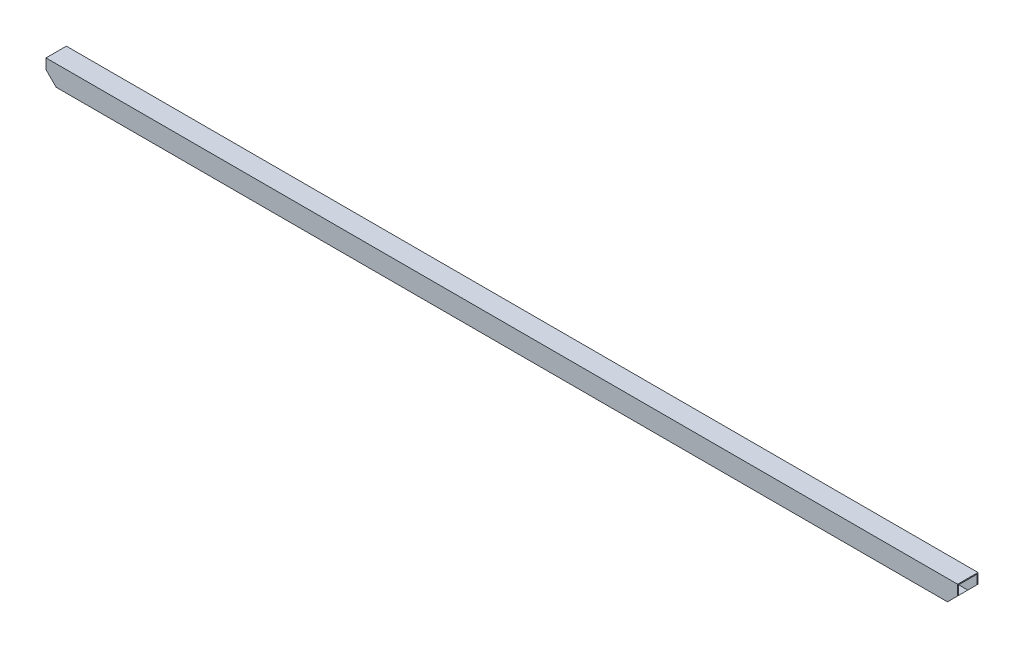
ISO-10303-21;
HEADER;
FILE_DESCRIPTION(('STEP AP214'),'2;1');
FILE_NAME('part.step','',(''),(''),'','','');
FILE_SCHEMA(('AUTOMOTIVE_DESIGN { 1 0 10303 214 1 1 1 1 }'));
ENDSEC;
DATA;
#1=APPLICATION_CONTEXT('core data for automotive mechanical design processes');
#2=APPLICATION_PROTOCOL_DEFINITION('international standard','automotive_design',2000,#1);
#3=PRODUCT_CONTEXT('',#1,'mechanical');
#4=PRODUCT('Part','Part','',(#3));
#5=PRODUCT_RELATED_PRODUCT_CATEGORY('part','',(#4));
#6=PRODUCT_DEFINITION_FORMATION('','',#4);
#7=PRODUCT_DEFINITION_CONTEXT('part definition',#1,'design');
#8=PRODUCT_DEFINITION('design','',#6,#7);
#9=PRODUCT_DEFINITION_SHAPE('','',#8);
#10=(LENGTH_UNIT() NAMED_UNIT(*) SI_UNIT(.MILLI.,.METRE.));
#11=(NAMED_UNIT(*) PLANE_ANGLE_UNIT() SI_UNIT($,.RADIAN.));
#12=(NAMED_UNIT(*) SI_UNIT($,.STERADIAN.) SOLID_ANGLE_UNIT());
#13=UNCERTAINTY_MEASURE_WITH_UNIT(LENGTH_MEASURE(1.E-05),#10,'distance_accuracy_value','');
#14=(GEOMETRIC_REPRESENTATION_CONTEXT(3) GLOBAL_UNCERTAINTY_ASSIGNED_CONTEXT((#13)) GLOBAL_UNIT_ASSIGNED_CONTEXT((#10,
#11,#12)) REPRESENTATION_CONTEXT('',''));
#15=CARTESIAN_POINT('',(0.,0.,0.));
#16=DIRECTION('',(0.,0.,1.));
#17=DIRECTION('',(1.,0.,0.));
#18=AXIS2_PLACEMENT_3D('',#15,#16,#17);
#19=CARTESIAN_POINT('',(-568.325,25.4,12.7));
#20=DIRECTION('',(0.,0.,-1.));
#21=DIRECTION('',(-1.,0.,0.));
#22=AXIS2_PLACEMENT_3D('',#19,#20,#21);
#23=PLANE('',#22);
#24=DIRECTION('',(-0.706542447553431,0.707670664790626,0.));
#25=VECTOR('',#24,1.);
#26=CARTESIAN_POINT('',(-555.645247213323,0.,12.7));
#27=LINE('',#26,#25);
#28=CARTESIAN_POINT('',(-555.645247213323,0.,12.7));
#29=VERTEX_POINT('',#28);
#30=CARTESIAN_POINT('',(-568.325,12.7,12.7));
#31=VERTEX_POINT('',#30);
#32=EDGE_CURVE('E157',#29,#31,#27,.T.);
#33=ORIENTED_EDGE('',*,*,#32,.F.);
#34=DIRECTION('',(1.,0.,0.));
#35=VECTOR('',#34,1.);
#36=CARTESIAN_POINT('',(-568.325,0.,12.7));
#37=LINE('',#36,#35);
#38=CARTESIAN_POINT('',(555.645247213323,0.,12.7));
#39=VERTEX_POINT('',#38);
#40=EDGE_CURVE('E201',#29,#39,#37,.T.);
#41=ORIENTED_EDGE('',*,*,#40,.T.);
#42=DIRECTION('',(-0.706542447553444,-0.707670664790614,0.));
#43=VECTOR('',#42,1.);
#44=CARTESIAN_POINT('',(555.645247213323,0.,12.7));
#45=LINE('',#44,#43);
#46=CARTESIAN_POINT('',(568.325,12.7,12.7));
#47=VERTEX_POINT('',#46);
#48=EDGE_CURVE('E222',#47,#39,#45,.T.);
#49=ORIENTED_EDGE('',*,*,#48,.F.);
#50=DIRECTION('',(0.,-1.,0.));
#51=VECTOR('',#50,1.);
#52=CARTESIAN_POINT('',(568.325,25.4,12.7));
#53=LINE('',#52,#51);
#54=CARTESIAN_POINT('',(568.325,25.4,12.7));
#55=VERTEX_POINT('',#54);
#56=EDGE_CURVE('E168',#55,#47,#53,.T.);
#57=ORIENTED_EDGE('',*,*,#56,.F.);
#58=DIRECTION('',(1.,0.,0.));
#59=VECTOR('',#58,1.);
#60=CARTESIAN_POINT('',(-568.325,25.4,12.7));
#61=LINE('',#60,#59);
#62=CARTESIAN_POINT('',(-568.325,25.4,12.7));
#63=VERTEX_POINT('',#62);
#64=EDGE_CURVE('E206',#63,#55,#61,.T.);
#65=ORIENTED_EDGE('',*,*,#64,.F.);
#66=DIRECTION('',(0.,-1.,0.));
#67=VECTOR('',#66,1.);
#68=CARTESIAN_POINT('',(-568.325,25.4,12.7));
#69=LINE('',#68,#67);
#70=EDGE_CURVE('E164',#63,#31,#69,.T.);
#71=ORIENTED_EDGE('',*,*,#70,.T.);
#72=EDGE_LOOP('',(#33,#41,#49,#57,#65,#71));
#73=FACE_BOUND('',#72,.T.);
#74=ADVANCED_FACE('F55',(#73),#23,.F.);
#75=CARTESIAN_POINT('',(0.,0.,0.));
#76=DIRECTION('',(0.,-1.,0.));
#77=DIRECTION('',(0.,0.,-1.));
#78=AXIS2_PLACEMENT_3D('',#75,#76,#77);
#79=PLANE('',#78);
#80=DIRECTION('',(0.,0.,1.));
#81=VECTOR('',#80,1.);
#82=CARTESIAN_POINT('',(-555.645247213323,0.,-12.7));
#83=LINE('',#82,#81);
#84=CARTESIAN_POINT('',(-555.645247213323,0.,-12.7));
#85=VERTEX_POINT('',#84);
#86=EDGE_CURVE('E146',#85,#29,#83,.T.);
#87=ORIENTED_EDGE('',*,*,#86,.F.);
#88=DIRECTION('',(-1.,0.,0.));
#89=VECTOR('',#88,1.);
#90=CARTESIAN_POINT('',(-568.325,0.,-12.7));
#91=LINE('',#90,#89);
#92=CARTESIAN_POINT('',(555.645247213323,0.,-12.7));
#93=VERTEX_POINT('',#92);
#94=EDGE_CURVE('E158',#93,#85,#91,.T.);
#95=ORIENTED_EDGE('',*,*,#94,.F.);
#96=DIRECTION('',(0.,0.,1.));
#97=VECTOR('',#96,1.);
#98=CARTESIAN_POINT('',(555.645247213323,0.,-12.7));
#99=LINE('',#98,#97);
#100=EDGE_CURVE('E229',#93,#39,#99,.T.);
#101=ORIENTED_EDGE('',*,*,#100,.T.);
#102=ORIENTED_EDGE('',*,*,#40,.F.);
#103=EDGE_LOOP('',(#87,#95,#101,#102));
#104=FACE_BOUND('',#103,.T.);
#105=ADVANCED_FACE('F265',(#104),#79,.T.);
#106=CARTESIAN_POINT('',(568.325,25.4,12.7));
#107=DIRECTION('',(-1.,0.,0.));
#108=DIRECTION('',(0.,0.,1.));
#109=AXIS2_PLACEMENT_3D('',#106,#107,#108);
#110=PLANE('',#109);
#111=DIRECTION('',(0.,0.,1.));
#112=VECTOR('',#111,1.);
#113=CARTESIAN_POINT('',(568.325,12.7,-12.7));
#114=LINE('',#113,#112);
#115=CARTESIAN_POINT('',(568.325,12.7,-12.7));
#116=VERTEX_POINT('',#115);
#117=CARTESIAN_POINT('',(568.325,12.7,-11.43));
#118=VERTEX_POINT('',#117);
#119=EDGE_CURVE('E226',#116,#118,#114,.T.);
#120=ORIENTED_EDGE('',*,*,#119,.F.);
#121=DIRECTION('',(0.,-1.,0.));
#122=VECTOR('',#121,1.);
#123=CARTESIAN_POINT('',(568.325,25.4,-12.7));
#124=LINE('',#123,#122);
#125=CARTESIAN_POINT('',(568.325,25.4,-12.7));
#126=VERTEX_POINT('',#125);
#127=EDGE_CURVE('E163',#126,#116,#124,.T.);
#128=ORIENTED_EDGE('',*,*,#127,.F.);
#129=DIRECTION('',(0.,0.,-1.));
#130=VECTOR('',#129,1.);
#131=CARTESIAN_POINT('',(568.325,25.4,12.7));
#132=LINE('',#131,#130);
#133=EDGE_CURVE('E200',#55,#126,#132,.T.);
#134=ORIENTED_EDGE('',*,*,#133,.F.);
#135=ORIENTED_EDGE('',*,*,#56,.T.);
#136=CARTESIAN_POINT('',(568.325,12.7,11.43));
#137=VERTEX_POINT('',#136);
#138=EDGE_CURVE('E214',#137,#47,#114,.T.);
#139=ORIENTED_EDGE('',*,*,#138,.F.);
#140=DIRECTION('',(0.,-1.,0.));
#141=VECTOR('',#140,1.);
#142=CARTESIAN_POINT('',(568.325,1.27,11.43));
#143=LINE('',#142,#141);
#144=CARTESIAN_POINT('',(568.325,24.13,11.43));
#145=VERTEX_POINT('',#144);
#146=EDGE_CURVE('E179',#145,#137,#143,.T.);
#147=ORIENTED_EDGE('',*,*,#146,.F.);
#148=DIRECTION('',(0.,0.,1.));
#149=VECTOR('',#148,1.);
#150=CARTESIAN_POINT('',(568.325,24.13,11.43));
#151=LINE('',#150,#149);
#152=CARTESIAN_POINT('',(568.325,24.13,-11.43));
#153=VERTEX_POINT('',#152);
#154=EDGE_CURVE('E248',#153,#145,#151,.T.);
#155=ORIENTED_EDGE('',*,*,#154,.F.);
#156=DIRECTION('',(0.,1.,0.));
#157=VECTOR('',#156,1.);
#158=CARTESIAN_POINT('',(568.325,1.27,-11.43));
#159=LINE('',#158,#157);
#160=EDGE_CURVE('E239',#118,#153,#159,.T.);
#161=ORIENTED_EDGE('',*,*,#160,.F.);
#162=EDGE_LOOP('',(#120,#128,#134,#135,#139,#147,#155,#161));
#163=FACE_BOUND('',#162,.T.);
#164=ADVANCED_FACE('F53',(#163),#110,.F.);
#165=CARTESIAN_POINT('',(-568.325,25.4,-12.7));
#166=DIRECTION('',(0.,0.,1.));
#167=DIRECTION('',(1.,0.,0.));
#168=AXIS2_PLACEMENT_3D('',#165,#166,#167);
#169=PLANE('',#168);
#170=ORIENTED_EDGE('',*,*,#94,.T.);
#171=DIRECTION('',(-0.706542447553431,0.707670664790626,0.));
#172=VECTOR('',#171,1.);
#173=CARTESIAN_POINT('',(-555.645247213323,0.,-12.7));
#174=LINE('',#173,#172);
#175=CARTESIAN_POINT('',(-568.325,12.7,-12.7));
#176=VERTEX_POINT('',#175);
#177=EDGE_CURVE('E143',#85,#176,#174,.T.);
#178=ORIENTED_EDGE('',*,*,#177,.T.);
#179=DIRECTION('',(0.,-1.,0.));
#180=VECTOR('',#179,1.);
#181=CARTESIAN_POINT('',(-568.325,25.4,-12.7));
#182=LINE('',#181,#180);
#183=CARTESIAN_POINT('',(-568.325,25.4,-12.7));
#184=VERTEX_POINT('',#183);
#185=EDGE_CURVE('E152',#184,#176,#182,.T.);
#186=ORIENTED_EDGE('',*,*,#185,.F.);
#187=DIRECTION('',(-1.,0.,0.));
#188=VECTOR('',#187,1.);
#189=CARTESIAN_POINT('',(-568.325,25.4,-12.7));
#190=LINE('',#189,#188);
#191=EDGE_CURVE('E205',#126,#184,#190,.T.);
#192=ORIENTED_EDGE('',*,*,#191,.F.);
#193=ORIENTED_EDGE('',*,*,#127,.T.);
#194=DIRECTION('',(-0.706542447553444,-0.707670664790614,0.));
#195=VECTOR('',#194,1.);
#196=CARTESIAN_POINT('',(555.645247213323,0.,-12.7));
#197=LINE('',#196,#195);
#198=EDGE_CURVE('E221',#116,#93,#197,.T.);
#199=ORIENTED_EDGE('',*,*,#198,.T.);
#200=EDGE_LOOP('',(#170,#178,#186,#192,#193,#199));
#201=FACE_BOUND('',#200,.T.);
#202=ADVANCED_FACE('F153',(#201),#169,.F.);
#203=CARTESIAN_POINT('',(-568.325,25.4,12.7));
#204=DIRECTION('',(1.,0.,0.));
#205=DIRECTION('',(0.,0.,-1.));
#206=AXIS2_PLACEMENT_3D('',#203,#204,#205);
#207=PLANE('',#206);
#208=ORIENTED_EDGE('',*,*,#185,.T.);
#209=DIRECTION('',(0.,0.,1.));
#210=VECTOR('',#209,1.);
#211=CARTESIAN_POINT('',(-568.325,12.7,-12.7));
#212=LINE('',#211,#210);
#213=CARTESIAN_POINT('',(-568.325,12.7,-11.43));
#214=VERTEX_POINT('',#213);
#215=EDGE_CURVE('E138',#176,#214,#212,.T.);
#216=ORIENTED_EDGE('',*,*,#215,.T.);
#217=DIRECTION('',(0.,1.,0.));
#218=VECTOR('',#217,1.);
#219=CARTESIAN_POINT('',(-568.325,1.27,-11.43));
#220=LINE('',#219,#218);
#221=CARTESIAN_POINT('',(-568.325,24.13,-11.43));
#222=VERTEX_POINT('',#221);
#223=EDGE_CURVE('E238',#214,#222,#220,.T.);
#224=ORIENTED_EDGE('',*,*,#223,.T.);
#225=DIRECTION('',(0.,0.,1.));
#226=VECTOR('',#225,1.);
#227=CARTESIAN_POINT('',(-568.325,24.13,11.43));
#228=LINE('',#227,#226);
#229=CARTESIAN_POINT('',(-568.325,24.13,11.43));
#230=VERTEX_POINT('',#229);
#231=EDGE_CURVE('E244',#222,#230,#228,.T.);
#232=ORIENTED_EDGE('',*,*,#231,.T.);
#233=DIRECTION('',(0.,-1.,0.));
#234=VECTOR('',#233,1.);
#235=CARTESIAN_POINT('',(-568.325,1.27,11.43));
#236=LINE('',#235,#234);
#237=CARTESIAN_POINT('',(-568.325,12.7,11.43));
#238=VERTEX_POINT('',#237);
#239=EDGE_CURVE('E196',#230,#238,#236,.T.);
#240=ORIENTED_EDGE('',*,*,#239,.T.);
#241=EDGE_CURVE('E70',#238,#31,#212,.T.);
#242=ORIENTED_EDGE('',*,*,#241,.T.);
#243=ORIENTED_EDGE('',*,*,#70,.F.);
#244=DIRECTION('',(0.,0.,1.));
#245=VECTOR('',#244,1.);
#246=CARTESIAN_POINT('',(-568.325,25.4,12.7));
#247=LINE('',#246,#245);
#248=EDGE_CURVE('E162',#184,#63,#247,.T.);
#249=ORIENTED_EDGE('',*,*,#248,.F.);
#250=EDGE_LOOP('',(#208,#216,#224,#232,#240,#242,#243,#249));
#251=FACE_BOUND('',#250,.T.);
#252=ADVANCED_FACE('F161',(#251),#207,.F.);
#253=CARTESIAN_POINT('',(0.,25.4,0.));
#254=DIRECTION('',(0.,-1.,0.));
#255=DIRECTION('',(0.,0.,-1.));
#256=AXIS2_PLACEMENT_3D('',#253,#254,#255);
#257=PLANE('',#256);
#258=ORIENTED_EDGE('',*,*,#133,.T.);
#259=ORIENTED_EDGE('',*,*,#191,.T.);
#260=ORIENTED_EDGE('',*,*,#248,.T.);
#261=ORIENTED_EDGE('',*,*,#64,.T.);
#262=EDGE_LOOP('',(#258,#259,#260,#261));
#263=FACE_BOUND('',#262,.T.);
#264=ADVANCED_FACE('F271',(#263),#257,.F.);
#265=CARTESIAN_POINT('',(-568.325,1.27,-11.43));
#266=DIRECTION('',(0.,0.,-1.));
#267=DIRECTION('',(-1.,0.,0.));
#268=AXIS2_PLACEMENT_3D('',#265,#266,#267);
#269=PLANE('',#268);
#270=ORIENTED_EDGE('',*,*,#223,.F.);
#271=DIRECTION('',(0.706542447553432,-0.707670664790626,0.));
#272=VECTOR('',#271,1.);
#273=CARTESIAN_POINT('',(-562.610007274475,6.97588149112649,-11.43));
#274=LINE('',#273,#272);
#275=CARTESIAN_POINT('',(-556.91322249199,1.27,-11.43));
#276=VERTEX_POINT('',#275);
#277=EDGE_CURVE('E145',#214,#276,#274,.T.);
#278=ORIENTED_EDGE('',*,*,#277,.T.);
#279=DIRECTION('',(1.,0.,0.));
#280=VECTOR('',#279,1.);
#281=CARTESIAN_POINT('',(-568.325,1.27,-11.43));
#282=LINE('',#281,#280);
#283=CARTESIAN_POINT('',(556.91322249199,1.27,-11.43));
#284=VERTEX_POINT('',#283);
#285=EDGE_CURVE('E187',#276,#284,#282,.T.);
#286=ORIENTED_EDGE('',*,*,#285,.T.);
#287=DIRECTION('',(0.706542447553444,0.707670664790614,0.));
#288=VECTOR('',#287,1.);
#289=CARTESIAN_POINT('',(-4.80820767645596,-561.348395102681,-11.43));
#290=LINE('',#289,#288);
#291=EDGE_CURVE('E232',#284,#118,#290,.T.);
#292=ORIENTED_EDGE('',*,*,#291,.T.);
#293=ORIENTED_EDGE('',*,*,#160,.T.);
#294=DIRECTION('',(1.,0.,0.));
#295=VECTOR('',#294,1.);
#296=CARTESIAN_POINT('',(-568.325,24.13,-11.43));
#297=LINE('',#296,#295);
#298=EDGE_CURVE('E195',#222,#153,#297,.T.);
#299=ORIENTED_EDGE('',*,*,#298,.F.);
#300=EDGE_LOOP('',(#270,#278,#286,#292,#293,#299));
#301=FACE_BOUND('',#300,.T.);
#302=ADVANCED_FACE('F256',(#301),#269,.F.);
#303=CARTESIAN_POINT('',(-568.325,1.27,11.43));
#304=DIRECTION('',(0.,-1.,0.));
#305=DIRECTION('',(0.,0.,-1.));
#306=AXIS2_PLACEMENT_3D('',#303,#304,#305);
#307=PLANE('',#306);
#308=ORIENTED_EDGE('',*,*,#285,.F.);
#309=DIRECTION('',(0.,0.,1.));
#310=VECTOR('',#309,1.);
#311=CARTESIAN_POINT('',(-556.91322249199,1.27,11.43));
#312=LINE('',#311,#310);
#313=CARTESIAN_POINT('',(-556.91322249199,1.27,11.43));
#314=VERTEX_POINT('',#313);
#315=EDGE_CURVE('E189',#276,#314,#312,.T.);
#316=ORIENTED_EDGE('',*,*,#315,.T.);
#317=DIRECTION('',(1.,0.,0.));
#318=VECTOR('',#317,1.);
#319=CARTESIAN_POINT('',(-568.325,1.27,11.43));
#320=LINE('',#319,#318);
#321=CARTESIAN_POINT('',(556.91322249199,1.26999999999988,11.43));
#322=VERTEX_POINT('',#321);
#323=EDGE_CURVE('E178',#314,#322,#320,.T.);
#324=ORIENTED_EDGE('',*,*,#323,.T.);
#325=DIRECTION('',(0.,0.,-1.));
#326=VECTOR('',#325,1.);
#327=CARTESIAN_POINT('',(556.91322249199,1.27,11.43));
#328=LINE('',#327,#326);
#329=EDGE_CURVE('E74',#322,#284,#328,.T.);
#330=ORIENTED_EDGE('',*,*,#329,.T.);
#331=EDGE_LOOP('',(#308,#316,#324,#330));
#332=FACE_BOUND('',#331,.T.);
#333=ADVANCED_FACE('F183',(#332),#307,.F.);
#334=CARTESIAN_POINT('',(-568.325,1.27,11.43));
#335=DIRECTION('',(0.,0.,1.));
#336=DIRECTION('',(1.,0.,0.));
#337=AXIS2_PLACEMENT_3D('',#334,#335,#336);
#338=PLANE('',#337);
#339=ORIENTED_EDGE('',*,*,#323,.F.);
#340=DIRECTION('',(-0.706542447553432,0.707670664790626,0.));
#341=VECTOR('',#340,1.);
#342=CARTESIAN_POINT('',(-562.610007274475,6.97588149112649,11.43));
#343=LINE('',#342,#341);
#344=EDGE_CURVE('E12',#314,#238,#343,.T.);
#345=ORIENTED_EDGE('',*,*,#344,.T.);
#346=ORIENTED_EDGE('',*,*,#239,.F.);
#347=DIRECTION('',(1.,0.,0.));
#348=VECTOR('',#347,1.);
#349=CARTESIAN_POINT('',(-568.325,24.13,11.43));
#350=LINE('',#349,#348);
#351=EDGE_CURVE('E190',#230,#145,#350,.T.);
#352=ORIENTED_EDGE('',*,*,#351,.T.);
#353=ORIENTED_EDGE('',*,*,#146,.T.);
#354=DIRECTION('',(-0.706542447553444,-0.707670664790614,0.));
#355=VECTOR('',#354,1.);
#356=CARTESIAN_POINT('',(-4.80820767645596,-561.348395102681,11.43));
#357=LINE('',#356,#355);
#358=EDGE_CURVE('E58',#137,#322,#357,.T.);
#359=ORIENTED_EDGE('',*,*,#358,.T.);
#360=EDGE_LOOP('',(#339,#345,#346,#352,#353,#359));
#361=FACE_BOUND('',#360,.T.);
#362=ADVANCED_FACE('F180',(#361),#338,.F.);
#363=CARTESIAN_POINT('',(-568.325,24.13,11.43));
#364=DIRECTION('',(0.,1.,0.));
#365=DIRECTION('',(0.,0.,1.));
#366=AXIS2_PLACEMENT_3D('',#363,#364,#365);
#367=PLANE('',#366);
#368=ORIENTED_EDGE('',*,*,#154,.T.);
#369=ORIENTED_EDGE('',*,*,#351,.F.);
#370=ORIENTED_EDGE('',*,*,#231,.F.);
#371=ORIENTED_EDGE('',*,*,#298,.T.);
#372=EDGE_LOOP('',(#368,#369,#370,#371));
#373=FACE_BOUND('',#372,.T.);
#374=ADVANCED_FACE('F251',(#373),#367,.F.);
#375=CARTESIAN_POINT('',(555.645247213323,0.,-12.7));
#376=DIRECTION('',(-0.707670664790614,0.706542447553444,0.));
#377=DIRECTION('',(-0.706542447553444,-0.707670664790614,0.));
#378=AXIS2_PLACEMENT_3D('',#375,#376,#377);
#379=PLANE('',#378);
#380=ORIENTED_EDGE('',*,*,#329,.F.);
#381=ORIENTED_EDGE('',*,*,#358,.F.);
#382=ORIENTED_EDGE('',*,*,#138,.T.);
#383=ORIENTED_EDGE('',*,*,#48,.T.);
#384=ORIENTED_EDGE('',*,*,#100,.F.);
#385=ORIENTED_EDGE('',*,*,#198,.F.);
#386=ORIENTED_EDGE('',*,*,#119,.T.);
#387=ORIENTED_EDGE('',*,*,#291,.F.);
#388=EDGE_LOOP('',(#380,#381,#382,#383,#384,#385,#386,#387));
#389=FACE_BOUND('',#388,.T.);
#390=ADVANCED_FACE('F259',(#389),#379,.F.);
#391=CARTESIAN_POINT('',(-555.645247213323,0.,-12.7));
#392=DIRECTION('',(0.707670664790626,0.706542447553431,0.));
#393=DIRECTION('',(-0.706542447553431,0.707670664790626,0.));
#394=AXIS2_PLACEMENT_3D('',#391,#392,#393);
#395=PLANE('',#394);
#396=ORIENTED_EDGE('',*,*,#215,.F.);
#397=ORIENTED_EDGE('',*,*,#177,.F.);
#398=ORIENTED_EDGE('',*,*,#86,.T.);
#399=ORIENTED_EDGE('',*,*,#32,.T.);
#400=ORIENTED_EDGE('',*,*,#241,.F.);
#401=ORIENTED_EDGE('',*,*,#344,.F.);
#402=ORIENTED_EDGE('',*,*,#315,.F.);
#403=ORIENTED_EDGE('',*,*,#277,.F.);
#404=EDGE_LOOP('',(#396,#397,#398,#399,#400,#401,#402,#403));
#405=FACE_BOUND('',#404,.T.);
#406=ADVANCED_FACE('F139',(#405),#395,.F.);
#407=CLOSED_SHELL('',(#74,#105,#164,#202,#252,#264,#302,#333,#362,#374,#390,#406));
#408=MANIFOLD_SOLID_BREP('B2',#407);
#409=ADVANCED_BREP_SHAPE_REPRESENTATION('',(#18,#408),#14);
#410=SHAPE_DEFINITION_REPRESENTATION(#9,#409);
ENDSEC;
END-ISO-10303-21;
